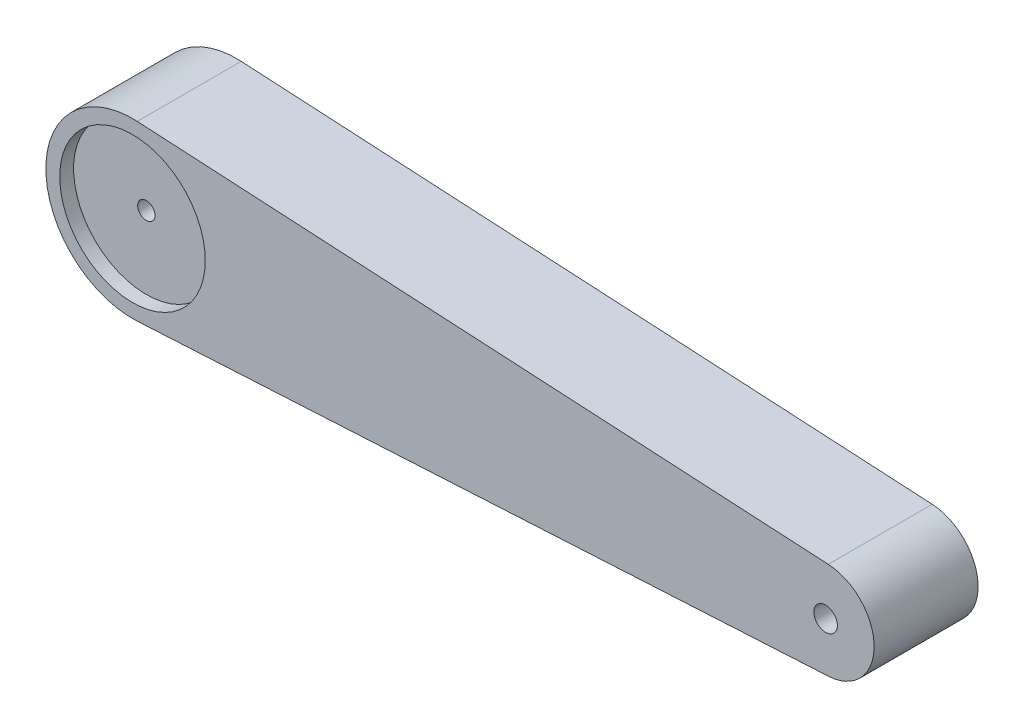
ISO-10303-21;
HEADER;
FILE_DESCRIPTION(('STEP AP214'),'2;1');
FILE_NAME('part.step','',(''),(''),'','','');
FILE_SCHEMA(('AUTOMOTIVE_DESIGN { 1 0 10303 214 1 1 1 1 }'));
ENDSEC;
DATA;
#1=APPLICATION_CONTEXT('core data for automotive mechanical design processes');
#2=APPLICATION_PROTOCOL_DEFINITION('international standard','automotive_design',2000,#1);
#3=PRODUCT_CONTEXT('',#1,'mechanical');
#4=PRODUCT('Part','Part','',(#3));
#5=PRODUCT_RELATED_PRODUCT_CATEGORY('part','',(#4));
#6=PRODUCT_DEFINITION_FORMATION('','',#4);
#7=PRODUCT_DEFINITION_CONTEXT('part definition',#1,'design');
#8=PRODUCT_DEFINITION('design','',#6,#7);
#9=PRODUCT_DEFINITION_SHAPE('','',#8);
#10=(LENGTH_UNIT() NAMED_UNIT(*) SI_UNIT(.MILLI.,.METRE.));
#11=(NAMED_UNIT(*) PLANE_ANGLE_UNIT() SI_UNIT($,.RADIAN.));
#12=(NAMED_UNIT(*) SI_UNIT($,.STERADIAN.) SOLID_ANGLE_UNIT());
#13=UNCERTAINTY_MEASURE_WITH_UNIT(LENGTH_MEASURE(1.E-05),#10,'distance_accuracy_value','');
#14=(GEOMETRIC_REPRESENTATION_CONTEXT(3) GLOBAL_UNCERTAINTY_ASSIGNED_CONTEXT((#13)) GLOBAL_UNIT_ASSIGNED_CONTEXT((#10,
#11,#12)) REPRESENTATION_CONTEXT('',''));
#15=CARTESIAN_POINT('',(0.,0.,0.));
#16=DIRECTION('',(0.,0.,1.));
#17=DIRECTION('',(1.,0.,0.));
#18=AXIS2_PLACEMENT_3D('',#15,#16,#17);
#19=CARTESIAN_POINT('',(0.,0.,0.));
#20=DIRECTION('',(0.,0.,1.));
#21=DIRECTION('',(1.,0.,0.));
#22=AXIS2_PLACEMENT_3D('',#19,#20,#21);
#23=PLANE('',#22);
#24=CARTESIAN_POINT('',(100.,0.,0.));
#25=DIRECTION('',(0.,0.,1.));
#26=DIRECTION('',(1.,0.,0.));
#27=AXIS2_PLACEMENT_3D('',#24,#25,#26);
#28=CIRCLE('',#27,1.69999999999999);
#29=CARTESIAN_POINT('',(101.7,0.,0.));
#30=VERTEX_POINT('',#29);
#31=EDGE_CURVE('E133',#30,#30,#28,.T.);
#32=ORIENTED_EDGE('',*,*,#31,.T.);
#33=EDGE_LOOP('',(#32));
#34=FACE_BOUND('',#33,.T.);
#35=CARTESIAN_POINT('',(0.,0.,0.));
#36=DIRECTION('',(0.,0.,1.));
#37=DIRECTION('',(1.,0.,0.));
#38=AXIS2_PLACEMENT_3D('',#35,#36,#37);
#39=CIRCLE('',#38,12.5);
#40=CARTESIAN_POINT('',(0.6875,12.481079430482,0.));
#41=VERTEX_POINT('',#40);
#42=CARTESIAN_POINT('',(0.6875,-12.481079430482,0.));
#43=VERTEX_POINT('',#42);
#44=EDGE_CURVE('E108',#41,#43,#39,.T.);
#45=ORIENTED_EDGE('',*,*,#44,.F.);
#46=DIRECTION('',(-0.998486354438557,0.055,0.));
#47=VECTOR('',#46,1.);
#48=CARTESIAN_POINT('',(0.6875,12.481079430482,0.));
#49=LINE('',#48,#47);
#50=CARTESIAN_POINT('',(100.385,6.9894044810699,0.));
#51=VERTEX_POINT('',#50);
#52=EDGE_CURVE('E80',#51,#41,#49,.T.);
#53=ORIENTED_EDGE('',*,*,#52,.F.);
#54=CARTESIAN_POINT('',(100.,0.,0.));
#55=DIRECTION('',(0.,0.,1.));
#56=DIRECTION('',(1.,0.,0.));
#57=AXIS2_PLACEMENT_3D('',#54,#55,#56);
#58=CIRCLE('',#57,7.);
#59=CARTESIAN_POINT('',(100.385,-6.9894044810699,0.));
#60=VERTEX_POINT('',#59);
#61=EDGE_CURVE('E74',#60,#51,#58,.T.);
#62=ORIENTED_EDGE('',*,*,#61,.F.);
#63=DIRECTION('',(0.998486354438557,0.055,0.));
#64=VECTOR('',#63,1.);
#65=CARTESIAN_POINT('',(0.6875,-12.481079430482,0.));
#66=LINE('',#65,#64);
#67=EDGE_CURVE('E97',#43,#60,#66,.T.);
#68=ORIENTED_EDGE('',*,*,#67,.F.);
#69=EDGE_LOOP('',(#45,#53,#62,#68));
#70=FACE_BOUND('',#69,.T.);
#71=CARTESIAN_POINT('',(0.,0.,0.));
#72=DIRECTION('',(0.,0.,-1.));
#73=DIRECTION('',(-1.,0.,0.));
#74=AXIS2_PLACEMENT_3D('',#71,#72,#73);
#75=CIRCLE('',#74,5.);
#76=CARTESIAN_POINT('',(-5.,0.,0.));
#77=VERTEX_POINT('',#76);
#78=EDGE_CURVE('E152',#77,#77,#75,.T.);
#79=ORIENTED_EDGE('',*,*,#78,.F.);
#80=EDGE_LOOP('',(#79));
#81=FACE_BOUND('',#80,.T.);
#82=ADVANCED_FACE('F39',(#34,#70,#81),#23,.F.);
#83=CARTESIAN_POINT('',(0.,0.,15.));
#84=DIRECTION('',(0.,0.,-1.));
#85=DIRECTION('',(-1.,0.,0.));
#86=AXIS2_PLACEMENT_3D('',#83,#84,#85);
#87=CYLINDRICAL_SURFACE('',#86,12.5);
#88=ORIENTED_EDGE('',*,*,#44,.T.);
#89=DIRECTION('',(0.,0.,-1.));
#90=VECTOR('',#89,1.);
#91=CARTESIAN_POINT('',(0.6875,-12.481079430482,15.));
#92=LINE('',#91,#90);
#93=CARTESIAN_POINT('',(0.6875,-12.481079430482,15.));
#94=VERTEX_POINT('',#93);
#95=EDGE_CURVE('E11',#94,#43,#92,.T.);
#96=ORIENTED_EDGE('',*,*,#95,.F.);
#97=CARTESIAN_POINT('',(0.,0.,15.));
#98=DIRECTION('',(0.,0.,1.));
#99=DIRECTION('',(1.,0.,0.));
#100=AXIS2_PLACEMENT_3D('',#97,#98,#99);
#101=CIRCLE('',#100,12.5);
#102=CARTESIAN_POINT('',(0.6875,12.481079430482,15.));
#103=VERTEX_POINT('',#102);
#104=EDGE_CURVE('E92',#103,#94,#101,.T.);
#105=ORIENTED_EDGE('',*,*,#104,.F.);
#106=DIRECTION('',(0.,0.,-1.));
#107=VECTOR('',#106,1.);
#108=CARTESIAN_POINT('',(0.6875,12.481079430482,15.));
#109=LINE('',#108,#107);
#110=EDGE_CURVE('E104',#103,#41,#109,.T.);
#111=ORIENTED_EDGE('',*,*,#110,.T.);
#112=EDGE_LOOP('',(#88,#96,#105,#111));
#113=FACE_BOUND('',#112,.T.);
#114=ADVANCED_FACE('F41',(#113),#87,.T.);
#115=CARTESIAN_POINT('',(0.6875,-12.481079430482,15.));
#116=DIRECTION('',(-0.055,0.998486354438557,0.));
#117=DIRECTION('',(-0.998486354438557,-0.055,0.));
#118=AXIS2_PLACEMENT_3D('',#115,#116,#117);
#119=PLANE('',#118);
#120=ORIENTED_EDGE('',*,*,#67,.T.);
#121=DIRECTION('',(0.,0.,-1.));
#122=VECTOR('',#121,1.);
#123=CARTESIAN_POINT('',(100.385,-6.9894044810699,15.));
#124=LINE('',#123,#122);
#125=CARTESIAN_POINT('',(100.385,-6.9894044810699,15.));
#126=VERTEX_POINT('',#125);
#127=EDGE_CURVE('E49',#126,#60,#124,.T.);
#128=ORIENTED_EDGE('',*,*,#127,.F.);
#129=DIRECTION('',(0.998486354438557,0.055,0.));
#130=VECTOR('',#129,1.);
#131=CARTESIAN_POINT('',(0.6875,-12.481079430482,15.));
#132=LINE('',#131,#130);
#133=EDGE_CURVE('E87',#94,#126,#132,.T.);
#134=ORIENTED_EDGE('',*,*,#133,.F.);
#135=ORIENTED_EDGE('',*,*,#95,.T.);
#136=EDGE_LOOP('',(#120,#128,#134,#135));
#137=FACE_BOUND('',#136,.T.);
#138=ADVANCED_FACE('F96',(#137),#119,.F.);
#139=CARTESIAN_POINT('',(100.,0.,15.));
#140=DIRECTION('',(0.,0.,-1.));
#141=DIRECTION('',(-1.,0.,0.));
#142=AXIS2_PLACEMENT_3D('',#139,#140,#141);
#143=CYLINDRICAL_SURFACE('',#142,7.);
#144=ORIENTED_EDGE('',*,*,#61,.T.);
#145=DIRECTION('',(0.,0.,-1.));
#146=VECTOR('',#145,1.);
#147=CARTESIAN_POINT('',(100.385,6.9894044810699,15.));
#148=LINE('',#147,#146);
#149=CARTESIAN_POINT('',(100.385,6.9894044810699,15.));
#150=VERTEX_POINT('',#149);
#151=EDGE_CURVE('E99',#150,#51,#148,.T.);
#152=ORIENTED_EDGE('',*,*,#151,.F.);
#153=CARTESIAN_POINT('',(100.,0.,15.));
#154=DIRECTION('',(0.,0.,1.));
#155=DIRECTION('',(1.,0.,0.));
#156=AXIS2_PLACEMENT_3D('',#153,#154,#155);
#157=CIRCLE('',#156,7.);
#158=EDGE_CURVE('E90',#126,#150,#157,.T.);
#159=ORIENTED_EDGE('',*,*,#158,.F.);
#160=ORIENTED_EDGE('',*,*,#127,.T.);
#161=EDGE_LOOP('',(#144,#152,#159,#160));
#162=FACE_BOUND('',#161,.T.);
#163=ADVANCED_FACE('F100',(#162),#143,.T.);
#164=CARTESIAN_POINT('',(0.6875,12.481079430482,15.));
#165=DIRECTION('',(-0.055,-0.998486354438557,0.));
#166=DIRECTION('',(0.998486354438557,-0.055,0.));
#167=AXIS2_PLACEMENT_3D('',#164,#165,#166);
#168=PLANE('',#167);
#169=ORIENTED_EDGE('',*,*,#52,.T.);
#170=ORIENTED_EDGE('',*,*,#110,.F.);
#171=DIRECTION('',(-0.998486354438557,0.055,0.));
#172=VECTOR('',#171,1.);
#173=CARTESIAN_POINT('',(0.6875,12.481079430482,15.));
#174=LINE('',#173,#172);
#175=EDGE_CURVE('E57',#150,#103,#174,.T.);
#176=ORIENTED_EDGE('',*,*,#175,.F.);
#177=ORIENTED_EDGE('',*,*,#151,.T.);
#178=EDGE_LOOP('',(#169,#170,#176,#177));
#179=FACE_BOUND('',#178,.T.);
#180=ADVANCED_FACE('F122',(#179),#168,.F.);
#181=CARTESIAN_POINT('',(0.,0.,15.));
#182=DIRECTION('',(0.,0.,1.));
#183=DIRECTION('',(1.,0.,0.));
#184=AXIS2_PLACEMENT_3D('',#181,#182,#183);
#185=PLANE('',#184);
#186=CARTESIAN_POINT('',(100.,0.,15.));
#187=DIRECTION('',(0.,0.,1.));
#188=DIRECTION('',(1.,0.,0.));
#189=AXIS2_PLACEMENT_3D('',#186,#187,#188);
#190=CIRCLE('',#189,1.69999999999999);
#191=CARTESIAN_POINT('',(101.7,0.,15.));
#192=VERTEX_POINT('',#191);
#193=EDGE_CURVE('E140',#192,#192,#190,.T.);
#194=ORIENTED_EDGE('',*,*,#193,.F.);
#195=EDGE_LOOP('',(#194));
#196=FACE_BOUND('',#195,.T.);
#197=CARTESIAN_POINT('',(0.,0.,15.));
#198=DIRECTION('',(0.,0.,1.));
#199=DIRECTION('',(1.,0.,0.));
#200=AXIS2_PLACEMENT_3D('',#197,#198,#199);
#201=CIRCLE('',#200,10.5);
#202=CARTESIAN_POINT('',(10.5,0.,15.));
#203=VERTEX_POINT('',#202);
#204=EDGE_CURVE('E129',#203,#203,#201,.T.);
#205=ORIENTED_EDGE('',*,*,#204,.F.);
#206=EDGE_LOOP('',(#205));
#207=FACE_BOUND('',#206,.T.);
#208=ORIENTED_EDGE('',*,*,#104,.T.);
#209=ORIENTED_EDGE('',*,*,#133,.T.);
#210=ORIENTED_EDGE('',*,*,#158,.T.);
#211=ORIENTED_EDGE('',*,*,#175,.T.);
#212=EDGE_LOOP('',(#208,#209,#210,#211));
#213=FACE_BOUND('',#212,.T.);
#214=ADVANCED_FACE('F88',(#196,#207,#213),#185,.T.);
#215=CARTESIAN_POINT('',(0.,0.,13.));
#216=DIRECTION('',(0.,0.,1.));
#217=DIRECTION('',(1.,0.,0.));
#218=AXIS2_PLACEMENT_3D('',#215,#216,#217);
#219=CYLINDRICAL_SURFACE('',#218,10.5);
#220=CARTESIAN_POINT('',(0.,0.,13.));
#221=DIRECTION('',(0.,0.,1.));
#222=DIRECTION('',(1.,0.,0.));
#223=AXIS2_PLACEMENT_3D('',#220,#221,#222);
#224=CIRCLE('',#223,10.5);
#225=CARTESIAN_POINT('',(10.5,0.,13.));
#226=VERTEX_POINT('',#225);
#227=EDGE_CURVE('E112',#226,#226,#224,.T.);
#228=ORIENTED_EDGE('',*,*,#227,.F.);
#229=EDGE_LOOP('',(#228));
#230=FACE_BOUND('',#229,.T.);
#231=ORIENTED_EDGE('',*,*,#204,.T.);
#232=EDGE_LOOP('',(#231));
#233=FACE_BOUND('',#232,.T.);
#234=ADVANCED_FACE('F190',(#230,#233),#219,.F.);
#235=CARTESIAN_POINT('',(0.,0.,13.));
#236=DIRECTION('',(0.,0.,1.));
#237=DIRECTION('',(1.,0.,0.));
#238=AXIS2_PLACEMENT_3D('',#235,#236,#237);
#239=PLANE('',#238);
#240=CARTESIAN_POINT('',(0.,0.,13.));
#241=DIRECTION('',(0.,0.,1.));
#242=DIRECTION('',(1.,0.,0.));
#243=AXIS2_PLACEMENT_3D('',#240,#241,#242);
#244=CIRCLE('',#243,1.25);
#245=CARTESIAN_POINT('',(1.25,0.,13.));
#246=VERTEX_POINT('',#245);
#247=EDGE_CURVE('E144',#246,#246,#244,.T.);
#248=ORIENTED_EDGE('',*,*,#247,.F.);
#249=EDGE_LOOP('',(#248));
#250=FACE_BOUND('',#249,.T.);
#251=ORIENTED_EDGE('',*,*,#227,.T.);
#252=EDGE_LOOP('',(#251));
#253=FACE_BOUND('',#252,.T.);
#254=ADVANCED_FACE('F197',(#250,#253),#239,.T.);
#255=CARTESIAN_POINT('',(100.,0.,15.));
#256=DIRECTION('',(0.,0.,1.));
#257=DIRECTION('',(1.,0.,0.));
#258=AXIS2_PLACEMENT_3D('',#255,#256,#257);
#259=CYLINDRICAL_SURFACE('',#258,1.69999999999999);
#260=ORIENTED_EDGE('',*,*,#31,.F.);
#261=EDGE_LOOP('',(#260));
#262=FACE_BOUND('',#261,.T.);
#263=ORIENTED_EDGE('',*,*,#193,.T.);
#264=EDGE_LOOP('',(#263));
#265=FACE_BOUND('',#264,.T.);
#266=ADVANCED_FACE('F204',(#262,#265),#259,.F.);
#267=CARTESIAN_POINT('',(0.,0.,0.));
#268=DIRECTION('',(0.,0.,-1.));
#269=DIRECTION('',(-1.,0.,0.));
#270=AXIS2_PLACEMENT_3D('',#267,#268,#269);
#271=CYLINDRICAL_SURFACE('',#270,1.25);
#272=CARTESIAN_POINT('',(0.,0.,3.75));
#273=DIRECTION('',(0.,0.,-1.));
#274=DIRECTION('',(-1.,0.,0.));
#275=AXIS2_PLACEMENT_3D('',#272,#273,#274);
#276=CIRCLE('',#275,1.25);
#277=CARTESIAN_POINT('',(-1.25,0.,3.75));
#278=VERTEX_POINT('',#277);
#279=EDGE_CURVE('E148',#278,#278,#276,.T.);
#280=ORIENTED_EDGE('',*,*,#279,.T.);
#281=EDGE_LOOP('',(#280));
#282=FACE_BOUND('',#281,.T.);
#283=ORIENTED_EDGE('',*,*,#247,.T.);
#284=EDGE_LOOP('',(#283));
#285=FACE_BOUND('',#284,.T.);
#286=ADVANCED_FACE('F212',(#282,#285),#271,.F.);
#287=CARTESIAN_POINT('',(0.,0.,0.));
#288=DIRECTION('',(0.,0.,-1.));
#289=DIRECTION('',(-1.,0.,0.));
#290=AXIS2_PLACEMENT_3D('',#287,#288,#289);
#291=CONICAL_SURFACE('',#290,5.,0.785398163397449);
#292=CARTESIAN_POINT('',(-1.25,0.,3.75));
#293=CARTESIAN_POINT('',(-1.2890625,0.,3.7109375));
#294=CARTESIAN_POINT('',(-1.328125,0.,3.671875));
#295=CARTESIAN_POINT('',(-1.40625,0.,3.59375));
#296=CARTESIAN_POINT('',(-1.4453125,0.,3.5546875));
#297=CARTESIAN_POINT('',(-1.5234375,0.,3.4765625));
#298=CARTESIAN_POINT('',(-1.5625,0.,3.4375));
#299=CARTESIAN_POINT('',(-1.640625,0.,3.359375));
#300=CARTESIAN_POINT('',(-1.6796875,0.,3.3203125));
#301=CARTESIAN_POINT('',(-1.7578125,0.,3.2421875));
#302=CARTESIAN_POINT('',(-1.796875,0.,3.203125));
#303=CARTESIAN_POINT('',(-1.875,0.,3.125));
#304=CARTESIAN_POINT('',(-1.9140625,0.,3.0859375));
#305=CARTESIAN_POINT('',(-1.9921875,0.,3.0078125));
#306=CARTESIAN_POINT('',(-2.03125,0.,2.96875));
#307=CARTESIAN_POINT('',(-2.109375,0.,2.890625));
#308=CARTESIAN_POINT('',(-2.1484375,0.,2.8515625));
#309=CARTESIAN_POINT('',(-2.2265625,0.,2.7734375));
#310=CARTESIAN_POINT('',(-2.265625,0.,2.734375));
#311=CARTESIAN_POINT('',(-2.34375,0.,2.65625));
#312=CARTESIAN_POINT('',(-2.3828125,0.,2.6171875));
#313=CARTESIAN_POINT('',(-2.4609375,0.,2.5390625));
#314=CARTESIAN_POINT('',(-2.5,0.,2.5));
#315=CARTESIAN_POINT('',(-2.578125,0.,2.421875));
#316=CARTESIAN_POINT('',(-2.6171875,0.,2.3828125));
#317=CARTESIAN_POINT('',(-2.6953125,0.,2.3046875));
#318=CARTESIAN_POINT('',(-2.734375,0.,2.265625));
#319=CARTESIAN_POINT('',(-2.8125,0.,2.1875));
#320=CARTESIAN_POINT('',(-2.8515625,0.,2.1484375));
#321=CARTESIAN_POINT('',(-2.9296875,0.,2.0703125));
#322=CARTESIAN_POINT('',(-2.96875,0.,2.03125));
#323=CARTESIAN_POINT('',(-3.046875,0.,1.953125));
#324=CARTESIAN_POINT('',(-3.0859375,0.,1.9140625));
#325=CARTESIAN_POINT('',(-3.1640625,0.,1.8359375));
#326=CARTESIAN_POINT('',(-3.203125,0.,1.796875));
#327=CARTESIAN_POINT('',(-3.28125,0.,1.71875));
#328=CARTESIAN_POINT('',(-3.3203125,0.,1.6796875));
#329=CARTESIAN_POINT('',(-3.3984375,0.,1.6015625));
#330=CARTESIAN_POINT('',(-3.4375,0.,1.5625));
#331=CARTESIAN_POINT('',(-3.515625,0.,1.484375));
#332=CARTESIAN_POINT('',(-3.5546875,0.,1.4453125));
#333=CARTESIAN_POINT('',(-3.6328125,0.,1.3671875));
#334=CARTESIAN_POINT('',(-3.671875,0.,1.328125));
#335=CARTESIAN_POINT('',(-3.75,0.,1.25));
#336=CARTESIAN_POINT('',(-3.7890625,0.,1.2109375));
#337=CARTESIAN_POINT('',(-3.8671875,0.,1.1328125));
#338=CARTESIAN_POINT('',(-3.90625,0.,1.09375));
#339=CARTESIAN_POINT('',(-3.984375,0.,1.015625));
#340=CARTESIAN_POINT('',(-4.0234375,0.,0.9765625));
#341=CARTESIAN_POINT('',(-4.1015625,0.,0.8984375));
#342=CARTESIAN_POINT('',(-4.140625,0.,0.859375));
#343=CARTESIAN_POINT('',(-4.21875,0.,0.78125));
#344=CARTESIAN_POINT('',(-4.2578125,0.,0.7421875));
#345=CARTESIAN_POINT('',(-4.3359375,0.,0.6640625));
#346=CARTESIAN_POINT('',(-4.375,0.,0.625));
#347=CARTESIAN_POINT('',(-4.453125,0.,0.546875));
#348=CARTESIAN_POINT('',(-4.4921875,0.,0.5078125));
#349=CARTESIAN_POINT('',(-4.5703125,0.,0.4296875));
#350=CARTESIAN_POINT('',(-4.609375,0.,0.390625));
#351=CARTESIAN_POINT('',(-4.6875,0.,0.3125));
#352=CARTESIAN_POINT('',(-4.7265625,0.,0.2734375));
#353=CARTESIAN_POINT('',(-4.8046875,0.,0.1953125));
#354=CARTESIAN_POINT('',(-4.84375,0.,0.15625));
#355=CARTESIAN_POINT('',(-4.921875,0.,0.0781250000000001));
#356=CARTESIAN_POINT('',(-4.9609375,0.,0.0390625000000001));
#357=CARTESIAN_POINT('',(-5.,0.,0.));
#358=B_SPLINE_CURVE_WITH_KNOTS('',3,(#292,#293,#294,#295,#296,#297,#298,#299,#300,#301,#302,
#303,#304,#305,#306,#307,#308,#309,#310,#311,#312,#313,#314,#315,#316,#317,#318,#319,#320,#321,
#322,#323,#324,#325,#326,#327,#328,#329,#330,#331,#332,#333,#334,#335,#336,#337,#338,#339,#340,
#341,#342,#343,#344,#345,#346,#347,#348,#349,#350,#351,#352,#353,#354,#355,#356,#357),
.UNSPECIFIED.,.F.,.F.,(4,2,2,2,2,2,2,2,2,2,2,2,2,2,2,2,2,2,2,2,2,2,2,2,2,2,2,2,2,2,2,2,4),(0.,
0.165728151840597,0.331456303681194,0.497184455521791,0.662912607362389,0.828640759202986,
0.994368911043583,1.16009706288418,1.32582521472478,1.49155336656537,1.65728151840597,
1.82300967024657,1.98873782208717,2.15446597392776,2.32019412576836,2.48592227760896,
2.65165042944955,2.81737858129015,2.98310673313075,3.14883488497135,3.31456303681194,
3.48029118865254,3.64601934049314,3.81174749233373,3.97747564417433,4.14320379601493,
4.30893194785553,4.47466009969612,4.64038825153672,4.80611640337731,4.97184455521791,
5.13757270705851,5.30330085889911),.UNSPECIFIED.);
#359=EDGE_CURVE('BSEAM157',#278,#77,#358,.T.);
#360=ORIENTED_EDGE('',*,*,#279,.F.);
#361=ORIENTED_EDGE('',*,*,#78,.T.);
#362=ORIENTED_EDGE('',*,*,#359,.T.);
#363=ORIENTED_EDGE('',*,*,#359,.F.);
#364=EDGE_LOOP('',(#360,#362,#361,#363));
#365=FACE_BOUND('',#364,.T.);
#366=ADVANCED_FACE('F157',(#365),#291,.F.);
#367=CLOSED_SHELL('',(#82,#114,#138,#163,#180,#214,#234,#254,#266,#286,#366));
#368=MANIFOLD_SOLID_BREP('B2',#367);
#369=ADVANCED_BREP_SHAPE_REPRESENTATION('',(#18,#368),#14);
#370=SHAPE_DEFINITION_REPRESENTATION(#9,#369);
ENDSEC;
END-ISO-10303-21;
